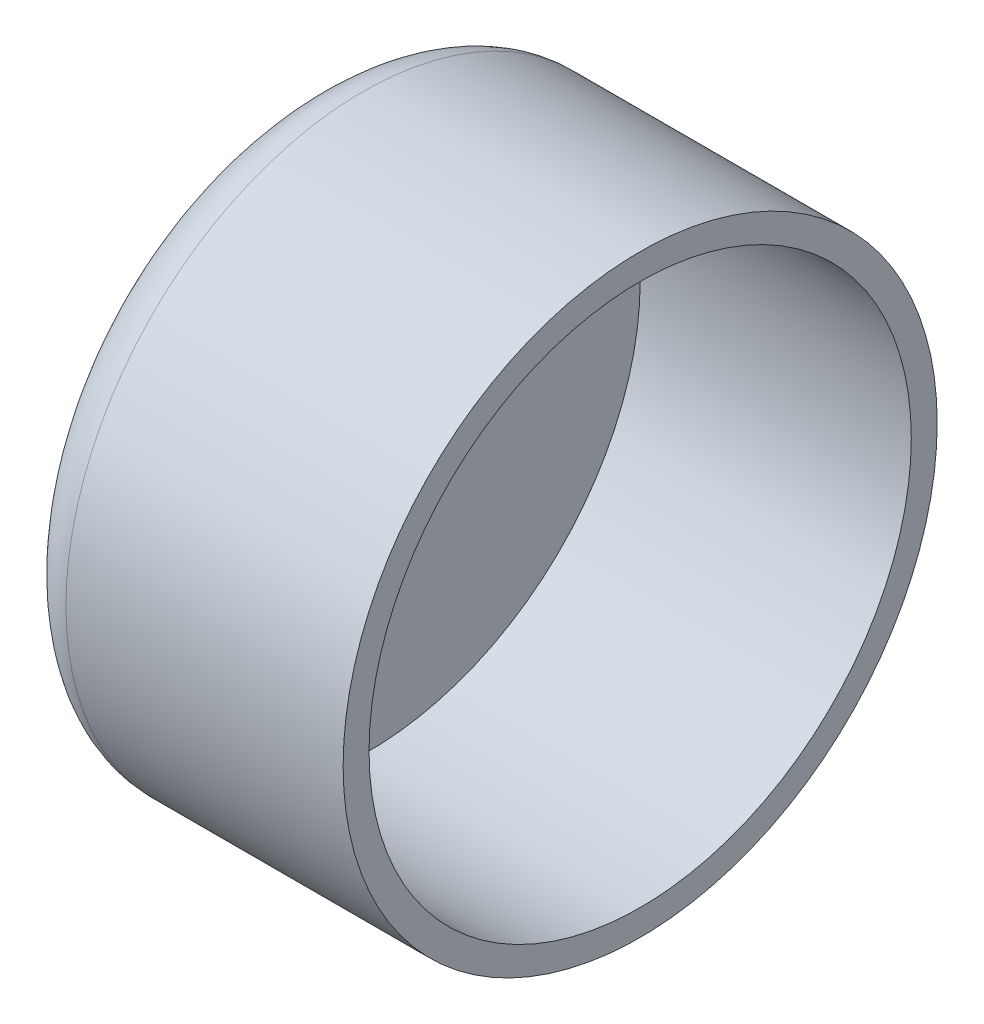
ISO-10303-21;
HEADER;
FILE_DESCRIPTION(('STEP AP214'),'2;1');
FILE_NAME('part.step','',(''),(''),'','','');
FILE_SCHEMA(('AUTOMOTIVE_DESIGN { 1 0 10303 214 1 1 1 1 }'));
ENDSEC;
DATA;
#1=APPLICATION_CONTEXT('core data for automotive mechanical design processes');
#2=APPLICATION_PROTOCOL_DEFINITION('international standard','automotive_design',2000,#1);
#3=PRODUCT_CONTEXT('',#1,'mechanical');
#4=PRODUCT('Part','Part','',(#3));
#5=PRODUCT_RELATED_PRODUCT_CATEGORY('part','',(#4));
#6=PRODUCT_DEFINITION_FORMATION('','',#4);
#7=PRODUCT_DEFINITION_CONTEXT('part definition',#1,'design');
#8=PRODUCT_DEFINITION('design','',#6,#7);
#9=PRODUCT_DEFINITION_SHAPE('','',#8);
#10=(LENGTH_UNIT() NAMED_UNIT(*) SI_UNIT(.MILLI.,.METRE.));
#11=(NAMED_UNIT(*) PLANE_ANGLE_UNIT() SI_UNIT($,.RADIAN.));
#12=(NAMED_UNIT(*) SI_UNIT($,.STERADIAN.) SOLID_ANGLE_UNIT());
#13=UNCERTAINTY_MEASURE_WITH_UNIT(LENGTH_MEASURE(1.E-05),#10,'distance_accuracy_value','');
#14=(GEOMETRIC_REPRESENTATION_CONTEXT(3) GLOBAL_UNCERTAINTY_ASSIGNED_CONTEXT((#13)) GLOBAL_UNIT_ASSIGNED_CONTEXT((#10,
#11,#12)) REPRESENTATION_CONTEXT('',''));
#15=CARTESIAN_POINT('',(0.,0.,0.));
#16=DIRECTION('',(0.,0.,1.));
#17=DIRECTION('',(1.,0.,0.));
#18=AXIS2_PLACEMENT_3D('',#15,#16,#17);
#19=CARTESIAN_POINT('',(-45.,0.,0.));
#20=DIRECTION('',(1.,0.,0.));
#21=DIRECTION('',(0.,0.,-1.));
#22=AXIS2_PLACEMENT_3D('',#19,#20,#21);
#23=CYLINDRICAL_SURFACE('',#22,49.3);
#24=CARTESIAN_POINT('',(0.,0.,0.));
#25=DIRECTION('',(1.,0.,0.));
#26=DIRECTION('',(0.,0.,-1.));
#27=AXIS2_PLACEMENT_3D('',#24,#25,#26);
#28=CIRCLE('',#27,49.3);
#29=CARTESIAN_POINT('',(0.,0.,-49.3));
#30=VERTEX_POINT('',#29);
#31=EDGE_CURVE('E12',#30,#30,#28,.T.);
#32=CARTESIAN_POINT('',(-46.,0.,0.));
#33=DIRECTION('',(-1.,0.,0.));
#34=DIRECTION('',(0.,0.,1.));
#35=AXIS2_PLACEMENT_3D('',#32,#33,#34);
#36=CIRCLE('',#35,49.3);
#37=CARTESIAN_POINT('',(-46.,0.,-49.3));
#38=VERTEX_POINT('',#37);
#39=EDGE_CURVE('E57',#38,#38,#36,.T.);
#40=CARTESIAN_POINT('',(0.,0.,-49.3));
#41=CARTESIAN_POINT('',(-0.479166666666674,0.,-49.3));
#42=CARTESIAN_POINT('',(-0.958333333333341,0.,-49.3));
#43=CARTESIAN_POINT('',(-1.91666666666667,0.,-49.3));
#44=CARTESIAN_POINT('',(-2.39583333333334,0.,-49.3));
#45=CARTESIAN_POINT('',(-3.35416666666667,0.,-49.3));
#46=CARTESIAN_POINT('',(-3.83333333333334,0.,-49.3));
#47=CARTESIAN_POINT('',(-4.79166666666667,0.,-49.3));
#48=CARTESIAN_POINT('',(-5.27083333333334,0.,-49.3));
#49=CARTESIAN_POINT('',(-6.22916666666667,0.,-49.3));
#50=CARTESIAN_POINT('',(-6.70833333333334,0.,-49.3));
#51=CARTESIAN_POINT('',(-7.66666666666667,0.,-49.3));
#52=CARTESIAN_POINT('',(-8.14583333333334,0.,-49.3));
#53=CARTESIAN_POINT('',(-9.10416666666667,0.,-49.3));
#54=CARTESIAN_POINT('',(-9.58333333333334,0.,-49.3));
#55=CARTESIAN_POINT('',(-10.5416666666667,0.,-49.3));
#56=CARTESIAN_POINT('',(-11.0208333333333,0.,-49.3));
#57=CARTESIAN_POINT('',(-11.9791666666667,0.,-49.3));
#58=CARTESIAN_POINT('',(-12.4583333333333,0.,-49.3));
#59=CARTESIAN_POINT('',(-13.4166666666667,0.,-49.3));
#60=CARTESIAN_POINT('',(-13.8958333333333,0.,-49.3));
#61=CARTESIAN_POINT('',(-14.8541666666667,0.,-49.3));
#62=CARTESIAN_POINT('',(-15.3333333333333,0.,-49.3));
#63=CARTESIAN_POINT('',(-16.2916666666667,0.,-49.3));
#64=CARTESIAN_POINT('',(-16.7708333333333,0.,-49.3));
#65=CARTESIAN_POINT('',(-17.7291666666667,0.,-49.3));
#66=CARTESIAN_POINT('',(-18.2083333333333,0.,-49.3));
#67=CARTESIAN_POINT('',(-19.1666666666667,0.,-49.3));
#68=CARTESIAN_POINT('',(-19.6458333333333,0.,-49.3));
#69=CARTESIAN_POINT('',(-20.6041666666667,0.,-49.3));
#70=CARTESIAN_POINT('',(-21.0833333333333,0.,-49.3));
#71=CARTESIAN_POINT('',(-22.0416666666667,0.,-49.3));
#72=CARTESIAN_POINT('',(-22.5208333333333,0.,-49.3));
#73=CARTESIAN_POINT('',(-23.4791666666667,0.,-49.3));
#74=CARTESIAN_POINT('',(-23.9583333333333,0.,-49.3));
#75=CARTESIAN_POINT('',(-24.9166666666667,0.,-49.3));
#76=CARTESIAN_POINT('',(-25.3958333333333,0.,-49.3));
#77=CARTESIAN_POINT('',(-26.3541666666667,0.,-49.3));
#78=CARTESIAN_POINT('',(-26.8333333333333,0.,-49.3));
#79=CARTESIAN_POINT('',(-27.7916666666667,0.,-49.3));
#80=CARTESIAN_POINT('',(-28.2708333333333,0.,-49.3));
#81=CARTESIAN_POINT('',(-29.2291666666667,0.,-49.3));
#82=CARTESIAN_POINT('',(-29.7083333333333,0.,-49.3));
#83=CARTESIAN_POINT('',(-30.6666666666667,0.,-49.3));
#84=CARTESIAN_POINT('',(-31.1458333333333,0.,-49.3));
#85=CARTESIAN_POINT('',(-32.1041666666667,0.,-49.3));
#86=CARTESIAN_POINT('',(-32.5833333333333,0.,-49.3));
#87=CARTESIAN_POINT('',(-33.5416666666667,0.,-49.3));
#88=CARTESIAN_POINT('',(-34.0208333333333,0.,-49.3));
#89=CARTESIAN_POINT('',(-34.9791666666667,0.,-49.3));
#90=CARTESIAN_POINT('',(-35.4583333333333,0.,-49.3));
#91=CARTESIAN_POINT('',(-36.4166666666667,0.,-49.3));
#92=CARTESIAN_POINT('',(-36.8958333333333,0.,-49.3));
#93=CARTESIAN_POINT('',(-37.8541666666667,0.,-49.3));
#94=CARTESIAN_POINT('',(-38.3333333333333,0.,-49.3));
#95=CARTESIAN_POINT('',(-39.2916666666667,0.,-49.3));
#96=CARTESIAN_POINT('',(-39.7708333333333,0.,-49.3));
#97=CARTESIAN_POINT('',(-40.7291666666667,0.,-49.3));
#98=CARTESIAN_POINT('',(-41.2083333333333,0.,-49.3));
#99=CARTESIAN_POINT('',(-42.1666666666667,0.,-49.3));
#100=CARTESIAN_POINT('',(-42.6458333333333,0.,-49.3));
#101=CARTESIAN_POINT('',(-43.6041666666667,0.,-49.3));
#102=CARTESIAN_POINT('',(-44.0833333333333,0.,-49.3));
#103=CARTESIAN_POINT('',(-45.0416666666667,0.,-49.3));
#104=CARTESIAN_POINT('',(-45.5208333333333,0.,-49.3));
#105=CARTESIAN_POINT('',(-46.,0.,-49.3));
#106=B_SPLINE_CURVE_WITH_KNOTS('',3,(#40,#41,#42,#43,#44,#45,#46,#47,#48,#49,#50,#51,#52,#53,
#54,#55,#56,#57,#58,#59,#60,#61,#62,#63,#64,#65,#66,#67,#68,#69,#70,#71,#72,#73,#74,#75,#76,#77,
#78,#79,#80,#81,#82,#83,#84,#85,#86,#87,#88,#89,#90,#91,#92,#93,#94,#95,#96,#97,#98,#99,#100,
#101,#102,#103,#104,#105),.UNSPECIFIED.,.F.,.F.,(4,2,2,2,2,2,2,2,2,2,2,2,2,2,2,2,2,2,2,2,2,2,2,
2,2,2,2,2,2,2,2,2,4),(0.,1.4375,2.875,4.3125,5.75,7.1875,8.625,10.0625,11.5,12.9375,14.375,
15.8125,17.25,18.6875,20.125,21.5625,23.,24.4375,25.875,27.3125,28.75,30.1875,31.625,33.0625,
34.5,35.9375,37.375,38.8125,40.25,41.6875,43.125,44.5625,46.),.UNSPECIFIED.);
#107=EDGE_CURVE('BSEAM40',#30,#38,#106,.T.);
#108=ORIENTED_EDGE('',*,*,#31,.F.);
#109=ORIENTED_EDGE('',*,*,#39,.F.);
#110=ORIENTED_EDGE('',*,*,#107,.T.);
#111=ORIENTED_EDGE('',*,*,#107,.F.);
#112=EDGE_LOOP('',(#108,#110,#109,#111));
#113=FACE_BOUND('',#112,.T.);
#114=ADVANCED_FACE('F40',(#113),#23,.T.);
#115=CARTESIAN_POINT('',(0.,0.,0.));
#116=DIRECTION('',(1.,0.,0.));
#117=DIRECTION('',(0.,0.,-1.));
#118=AXIS2_PLACEMENT_3D('',#115,#116,#117);
#119=PLANE('',#118);
#120=CARTESIAN_POINT('',(0.,0.,0.));
#121=DIRECTION('',(1.,0.,0.));
#122=DIRECTION('',(0.,0.,-1.));
#123=AXIS2_PLACEMENT_3D('',#120,#121,#122);
#124=CIRCLE('',#123,45.);
#125=CARTESIAN_POINT('',(0.,0.,-45.));
#126=VERTEX_POINT('',#125);
#127=EDGE_CURVE('E59',#126,#126,#124,.T.);
#128=ORIENTED_EDGE('',*,*,#127,.F.);
#129=EDGE_LOOP('',(#128));
#130=FACE_BOUND('',#129,.T.);
#131=ORIENTED_EDGE('',*,*,#31,.T.);
#132=EDGE_LOOP('',(#131));
#133=FACE_BOUND('',#132,.T.);
#134=ADVANCED_FACE('F70',(#130,#133),#119,.T.);
#135=CARTESIAN_POINT('',(-45.,0.,0.));
#136=DIRECTION('',(1.,0.,0.));
#137=DIRECTION('',(0.,0.,-1.));
#138=AXIS2_PLACEMENT_3D('',#135,#136,#137);
#139=CYLINDRICAL_SURFACE('',#138,45.);
#140=CARTESIAN_POINT('',(-45.,0.,0.));
#141=DIRECTION('',(1.,0.,0.));
#142=DIRECTION('',(0.,0.,-1.));
#143=AXIS2_PLACEMENT_3D('',#140,#141,#142);
#144=CIRCLE('',#143,45.);
#145=CARTESIAN_POINT('',(-45.,0.,-45.));
#146=VERTEX_POINT('',#145);
#147=EDGE_CURVE('E48',#146,#146,#144,.T.);
#148=CARTESIAN_POINT('',(-45.,0.,-45.));
#149=CARTESIAN_POINT('',(-44.53125,0.,-45.));
#150=CARTESIAN_POINT('',(-44.0625,0.,-45.));
#151=CARTESIAN_POINT('',(-43.125,0.,-45.));
#152=CARTESIAN_POINT('',(-42.65625,0.,-45.));
#153=CARTESIAN_POINT('',(-41.71875,0.,-45.));
#154=CARTESIAN_POINT('',(-41.25,0.,-45.));
#155=CARTESIAN_POINT('',(-40.3125,0.,-45.));
#156=CARTESIAN_POINT('',(-39.84375,0.,-45.));
#157=CARTESIAN_POINT('',(-38.90625,0.,-45.));
#158=CARTESIAN_POINT('',(-38.4375,0.,-45.));
#159=CARTESIAN_POINT('',(-37.5,0.,-45.));
#160=CARTESIAN_POINT('',(-37.03125,0.,-45.));
#161=CARTESIAN_POINT('',(-36.09375,0.,-45.));
#162=CARTESIAN_POINT('',(-35.625,0.,-45.));
#163=CARTESIAN_POINT('',(-34.6875,0.,-45.));
#164=CARTESIAN_POINT('',(-34.21875,0.,-45.));
#165=CARTESIAN_POINT('',(-33.28125,0.,-45.));
#166=CARTESIAN_POINT('',(-32.8125,0.,-45.));
#167=CARTESIAN_POINT('',(-31.875,0.,-45.));
#168=CARTESIAN_POINT('',(-31.40625,0.,-45.));
#169=CARTESIAN_POINT('',(-30.46875,0.,-45.));
#170=CARTESIAN_POINT('',(-30.,0.,-45.));
#171=CARTESIAN_POINT('',(-29.0625,0.,-45.));
#172=CARTESIAN_POINT('',(-28.59375,0.,-45.));
#173=CARTESIAN_POINT('',(-27.65625,0.,-45.));
#174=CARTESIAN_POINT('',(-27.1875,0.,-45.));
#175=CARTESIAN_POINT('',(-26.25,0.,-45.));
#176=CARTESIAN_POINT('',(-25.78125,0.,-45.));
#177=CARTESIAN_POINT('',(-24.84375,0.,-45.));
#178=CARTESIAN_POINT('',(-24.375,0.,-45.));
#179=CARTESIAN_POINT('',(-23.4375,0.,-45.));
#180=CARTESIAN_POINT('',(-22.96875,0.,-45.));
#181=CARTESIAN_POINT('',(-22.03125,0.,-45.));
#182=CARTESIAN_POINT('',(-21.5625,0.,-45.));
#183=CARTESIAN_POINT('',(-20.625,0.,-45.));
#184=CARTESIAN_POINT('',(-20.15625,0.,-45.));
#185=CARTESIAN_POINT('',(-19.21875,0.,-45.));
#186=CARTESIAN_POINT('',(-18.75,0.,-45.));
#187=CARTESIAN_POINT('',(-17.8125,0.,-45.));
#188=CARTESIAN_POINT('',(-17.34375,0.,-45.));
#189=CARTESIAN_POINT('',(-16.40625,0.,-45.));
#190=CARTESIAN_POINT('',(-15.9375,0.,-45.));
#191=CARTESIAN_POINT('',(-15.,0.,-45.));
#192=CARTESIAN_POINT('',(-14.53125,0.,-45.));
#193=CARTESIAN_POINT('',(-13.59375,0.,-45.));
#194=CARTESIAN_POINT('',(-13.125,0.,-45.));
#195=CARTESIAN_POINT('',(-12.1875,0.,-45.));
#196=CARTESIAN_POINT('',(-11.71875,0.,-45.));
#197=CARTESIAN_POINT('',(-10.78125,0.,-45.));
#198=CARTESIAN_POINT('',(-10.3125,0.,-45.));
#199=CARTESIAN_POINT('',(-9.37500000000001,0.,-45.));
#200=CARTESIAN_POINT('',(-8.90625000000001,0.,-45.));
#201=CARTESIAN_POINT('',(-7.96875000000001,0.,-45.));
#202=CARTESIAN_POINT('',(-7.50000000000001,0.,-45.));
#203=CARTESIAN_POINT('',(-6.56250000000001,0.,-45.));
#204=CARTESIAN_POINT('',(-6.09375000000001,0.,-45.));
#205=CARTESIAN_POINT('',(-5.15625000000001,0.,-45.));
#206=CARTESIAN_POINT('',(-4.68750000000001,0.,-45.));
#207=CARTESIAN_POINT('',(-3.75000000000001,0.,-45.));
#208=CARTESIAN_POINT('',(-3.28125000000001,0.,-45.));
#209=CARTESIAN_POINT('',(-2.34375000000001,0.,-45.));
#210=CARTESIAN_POINT('',(-1.87500000000001,0.,-45.));
#211=CARTESIAN_POINT('',(-0.937500000000006,0.,-45.));
#212=CARTESIAN_POINT('',(-0.468750000000007,0.,-45.));
#213=CARTESIAN_POINT('',(0.,0.,-45.));
#214=B_SPLINE_CURVE_WITH_KNOTS('',3,(#148,#149,#150,#151,#152,#153,#154,#155,#156,#157,#158,
#159,#160,#161,#162,#163,#164,#165,#166,#167,#168,#169,#170,#171,#172,#173,#174,#175,#176,#177,
#178,#179,#180,#181,#182,#183,#184,#185,#186,#187,#188,#189,#190,#191,#192,#193,#194,#195,#196,
#197,#198,#199,#200,#201,#202,#203,#204,#205,#206,#207,#208,#209,#210,#211,#212,#213),
.UNSPECIFIED.,.F.,.F.,(4,2,2,2,2,2,2,2,2,2,2,2,2,2,2,2,2,2,2,2,2,2,2,2,2,2,2,2,2,2,2,2,4),(0.,
1.40625,2.8125,4.21875,5.62500000000001,7.03125,8.4375,9.84375000000001,11.25,12.65625,14.0625,
15.46875,16.875,18.28125,19.6875,21.09375,22.5,23.90625,25.3125,26.71875,28.125,29.53125,
30.9375,32.34375,33.75,35.15625,36.5625,37.96875,39.375,40.78125,42.1875,43.59375,45.),.UNSPECIFIED.);
#215=EDGE_CURVE('BSEAM67',#146,#126,#214,.T.);
#216=ORIENTED_EDGE('',*,*,#147,.F.);
#217=ORIENTED_EDGE('',*,*,#127,.T.);
#218=ORIENTED_EDGE('',*,*,#215,.T.);
#219=ORIENTED_EDGE('',*,*,#215,.F.);
#220=EDGE_LOOP('',(#216,#218,#217,#219));
#221=FACE_BOUND('',#220,.T.);
#222=ADVANCED_FACE('F67',(#221),#139,.F.);
#223=CARTESIAN_POINT('',(-45.,0.,0.));
#224=DIRECTION('',(-1.,0.,0.));
#225=DIRECTION('',(0.,0.,1.));
#226=AXIS2_PLACEMENT_3D('',#223,#224,#225);
#227=PLANE('',#226);
#228=ORIENTED_EDGE('',*,*,#147,.T.);
#229=EDGE_LOOP('',(#228));
#230=FACE_BOUND('',#229,.T.);
#231=ADVANCED_FACE('F54',(#230),#227,.F.);
#232=CARTESIAN_POINT('',(-46.,0.,0.));
#233=DIRECTION('',(0.,1.,0.));
#234=DIRECTION('',(0.,0.,1.));
#235=AXIS2_PLACEMENT_3D('',#232,#233,#234);
#236=ELLIPSE('',#235,49.3,18.);
#237=TRIMMED_CURVE('',#236,(PARAMETER_VALUE(4.71238898038469)),
(PARAMETER_VALUE(7.85398163397448)),.T.,.PARAMETER.);
#238=CARTESIAN_POINT('',(-28.,0.,0.));
#239=DIRECTION('',(-1.,0.,0.));
#240=AXIS1_PLACEMENT('',#238,#239);
#241=SURFACE_OF_REVOLUTION('',#237,#240);
#242=CARTESIAN_POINT('',(-64.,0.,0.));
#243=VERTEX_POINT('',#242);
#244=VERTEX_LOOP('',#243);
#245=FACE_BOUND('',#244,.T.);
#246=ORIENTED_EDGE('',*,*,#39,.T.);
#247=EDGE_LOOP('',(#246));
#248=FACE_BOUND('',#247,.T.);
#249=ADVANCED_FACE('F42',(#245,#248),#241,.F.);
#250=CLOSED_SHELL('',(#114,#134,#222,#231,#249));
#251=MANIFOLD_SOLID_BREP('B2',#250);
#252=ADVANCED_BREP_SHAPE_REPRESENTATION('',(#18,#251),#14);
#253=SHAPE_DEFINITION_REPRESENTATION(#9,#252);
ENDSEC;
END-ISO-10303-21;
